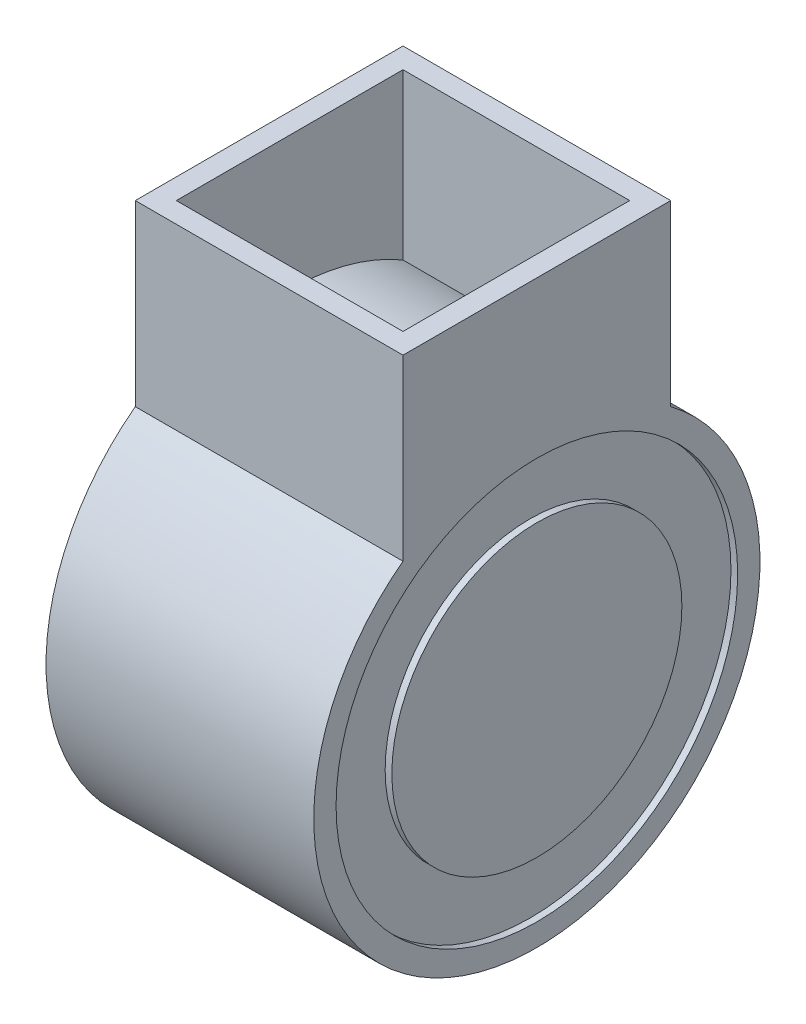
ISO-10303-21;
HEADER;
FILE_DESCRIPTION(('STEP AP214'),'2;1');
FILE_NAME('part.step','',(''),(''),'','','');
FILE_SCHEMA(('AUTOMOTIVE_DESIGN { 1 0 10303 214 1 1 1 1 }'));
ENDSEC;
DATA;
#1=APPLICATION_CONTEXT('core data for automotive mechanical design processes');
#2=APPLICATION_PROTOCOL_DEFINITION('international standard','automotive_design',2000,#1);
#3=PRODUCT_CONTEXT('',#1,'mechanical');
#4=PRODUCT('Part','Part','',(#3));
#5=PRODUCT_RELATED_PRODUCT_CATEGORY('part','',(#4));
#6=PRODUCT_DEFINITION_FORMATION('','',#4);
#7=PRODUCT_DEFINITION_CONTEXT('part definition',#1,'design');
#8=PRODUCT_DEFINITION('design','',#6,#7);
#9=PRODUCT_DEFINITION_SHAPE('','',#8);
#10=(LENGTH_UNIT() NAMED_UNIT(*) SI_UNIT(.MILLI.,.METRE.));
#11=(NAMED_UNIT(*) PLANE_ANGLE_UNIT() SI_UNIT($,.RADIAN.));
#12=(NAMED_UNIT(*) SI_UNIT($,.STERADIAN.) SOLID_ANGLE_UNIT());
#13=UNCERTAINTY_MEASURE_WITH_UNIT(LENGTH_MEASURE(1.E-05),#10,'distance_accuracy_value','');
#14=(GEOMETRIC_REPRESENTATION_CONTEXT(3) GLOBAL_UNCERTAINTY_ASSIGNED_CONTEXT((#13)) GLOBAL_UNIT_ASSIGNED_CONTEXT((#10,
#11,#12)) REPRESENTATION_CONTEXT('',''));
#15=CARTESIAN_POINT('',(0.,0.,0.));
#16=DIRECTION('',(0.,0.,1.));
#17=DIRECTION('',(1.,0.,0.));
#18=AXIS2_PLACEMENT_3D('',#15,#16,#17);
#19=CARTESIAN_POINT('',(30.,0.,0.));
#20=DIRECTION('',(-1.,0.,0.));
#21=DIRECTION('',(0.,0.,1.));
#22=AXIS2_PLACEMENT_3D('',#19,#20,#21);
#23=CYLINDRICAL_SURFACE('',#22,50.);
#24=DIRECTION('',(-1.,0.,0.));
#25=VECTOR('',#24,1.);
#26=CARTESIAN_POINT('',(30.,43.0678534408206,25.4));
#27=LINE('',#26,#25);
#28=CARTESIAN_POINT('',(-25.4,43.0678534408206,25.4));
#29=VERTEX_POINT('',#28);
#30=CARTESIAN_POINT('',(25.4,43.0678534408206,25.4));
#31=VERTEX_POINT('',#30);
#32=EDGE_CURVE('E76',#29,#31,#27,.F.);
#33=ORIENTED_EDGE('',*,*,#32,.T.);
#34=CARTESIAN_POINT('',(25.4,0.,0.));
#35=DIRECTION('',(1.,0.,0.));
#36=DIRECTION('',(0.,0.,-1.));
#37=AXIS2_PLACEMENT_3D('',#34,#35,#36);
#38=CIRCLE('',#37,50.);
#39=CARTESIAN_POINT('',(25.4,43.0678534408206,-25.4));
#40=VERTEX_POINT('',#39);
#41=EDGE_CURVE('E169',#31,#40,#38,.F.);
#42=ORIENTED_EDGE('',*,*,#41,.T.);
#43=DIRECTION('',(-1.,0.,0.));
#44=VECTOR('',#43,1.);
#45=CARTESIAN_POINT('',(30.,43.0678534408206,-25.4));
#46=LINE('',#45,#44);
#47=CARTESIAN_POINT('',(-25.4,43.0678534408206,-25.4));
#48=VERTEX_POINT('',#47);
#49=EDGE_CURVE('E165',#40,#48,#46,.T.);
#50=ORIENTED_EDGE('',*,*,#49,.T.);
#51=CARTESIAN_POINT('',(-25.4,0.,0.));
#52=DIRECTION('',(-1.,0.,0.));
#53=DIRECTION('',(0.,0.,1.));
#54=AXIS2_PLACEMENT_3D('',#51,#52,#53);
#55=CIRCLE('',#54,50.);
#56=EDGE_CURVE('E72',#48,#29,#55,.F.);
#57=ORIENTED_EDGE('',*,*,#56,.T.);
#58=EDGE_LOOP('',(#33,#42,#50,#57));
#59=FACE_BOUND('',#58,.T.);
#60=ADVANCED_FACE('F57',(#59),#23,.T.);
#61=CARTESIAN_POINT('',(-25.4,-50.002,25.4));
#62=DIRECTION('',(0.,0.,1.));
#63=DIRECTION('',(1.,0.,0.));
#64=AXIS2_PLACEMENT_3D('',#61,#62,#63);
#65=PLANE('',#64);
#66=ORIENTED_EDGE('',*,*,#32,.F.);
#67=DIRECTION('',(0.,1.,0.));
#68=VECTOR('',#67,1.);
#69=CARTESIAN_POINT('',(-25.4,-50.002,25.4));
#70=LINE('',#69,#68);
#71=CARTESIAN_POINT('',(-25.4,80.,25.4));
#72=VERTEX_POINT('',#71);
#73=EDGE_CURVE('E155',#29,#72,#70,.T.);
#74=ORIENTED_EDGE('',*,*,#73,.T.);
#75=DIRECTION('',(1.,0.,0.));
#76=VECTOR('',#75,1.);
#77=CARTESIAN_POINT('',(-25.4,80.,25.4));
#78=LINE('',#77,#76);
#79=CARTESIAN_POINT('',(25.4,80.,25.4));
#80=VERTEX_POINT('',#79);
#81=EDGE_CURVE('E252',#72,#80,#78,.T.);
#82=ORIENTED_EDGE('',*,*,#81,.T.);
#83=DIRECTION('',(0.,1.,0.));
#84=VECTOR('',#83,1.);
#85=CARTESIAN_POINT('',(25.4,-50.002,25.4));
#86=LINE('',#85,#84);
#87=EDGE_CURVE('E156',#31,#80,#86,.T.);
#88=ORIENTED_EDGE('',*,*,#87,.F.);
#89=EDGE_LOOP('',(#66,#74,#82,#88));
#90=FACE_BOUND('',#89,.T.);
#91=ADVANCED_FACE('F191',(#90),#65,.F.);
#92=CARTESIAN_POINT('',(-30.,-50.002,-30.));
#93=DIRECTION('',(0.,0.,-1.));
#94=DIRECTION('',(-1.,0.,0.));
#95=AXIS2_PLACEMENT_3D('',#92,#93,#94);
#96=PLANE('',#95);
#97=DIRECTION('',(0.,1.,0.));
#98=VECTOR('',#97,1.);
#99=CARTESIAN_POINT('',(30.,-50.002,-30.));
#100=LINE('',#99,#98);
#101=CARTESIAN_POINT('',(30.,40.,-30.));
#102=VERTEX_POINT('',#101);
#103=CARTESIAN_POINT('',(30.,80.,-30.));
#104=VERTEX_POINT('',#103);
#105=EDGE_CURVE('E130',#102,#104,#100,.T.);
#106=ORIENTED_EDGE('',*,*,#105,.F.);
#107=DIRECTION('',(-1.,0.,0.));
#108=VECTOR('',#107,1.);
#109=CARTESIAN_POINT('',(30.,40.,-30.));
#110=LINE('',#109,#108);
#111=CARTESIAN_POINT('',(-30.,40.,-30.));
#112=VERTEX_POINT('',#111);
#113=EDGE_CURVE('E128',#102,#112,#110,.T.);
#114=ORIENTED_EDGE('',*,*,#113,.T.);
#115=DIRECTION('',(0.,1.,0.));
#116=VECTOR('',#115,1.);
#117=CARTESIAN_POINT('',(-30.,-50.002,-30.));
#118=LINE('',#117,#116);
#119=CARTESIAN_POINT('',(-30.,80.,-30.));
#120=VERTEX_POINT('',#119);
#121=EDGE_CURVE('E121',#112,#120,#118,.T.);
#122=ORIENTED_EDGE('',*,*,#121,.T.);
#123=DIRECTION('',(-1.,0.,0.));
#124=VECTOR('',#123,1.);
#125=CARTESIAN_POINT('',(-30.,80.,-30.));
#126=LINE('',#125,#124);
#127=EDGE_CURVE('E126',#104,#120,#126,.T.);
#128=ORIENTED_EDGE('',*,*,#127,.F.);
#129=EDGE_LOOP('',(#106,#114,#122,#128));
#130=FACE_BOUND('',#129,.T.);
#131=ADVANCED_FACE('F124',(#130),#96,.T.);
#132=CARTESIAN_POINT('',(-25.4,-50.002,25.4));
#133=DIRECTION('',(-1.,0.,0.));
#134=DIRECTION('',(0.,0.,1.));
#135=AXIS2_PLACEMENT_3D('',#132,#133,#134);
#136=PLANE('',#135);
#137=ORIENTED_EDGE('',*,*,#56,.F.);
#138=DIRECTION('',(0.,1.,0.));
#139=VECTOR('',#138,1.);
#140=CARTESIAN_POINT('',(-25.4,-50.002,-25.4));
#141=LINE('',#140,#139);
#142=CARTESIAN_POINT('',(-25.4,80.,-25.4));
#143=VERTEX_POINT('',#142);
#144=EDGE_CURVE('E153',#48,#143,#141,.T.);
#145=ORIENTED_EDGE('',*,*,#144,.T.);
#146=DIRECTION('',(0.,0.,1.));
#147=VECTOR('',#146,1.);
#148=CARTESIAN_POINT('',(-25.4,80.,25.4));
#149=LINE('',#148,#147);
#150=EDGE_CURVE('E255',#143,#72,#149,.T.);
#151=ORIENTED_EDGE('',*,*,#150,.T.);
#152=ORIENTED_EDGE('',*,*,#73,.F.);
#153=EDGE_LOOP('',(#137,#145,#151,#152));
#154=FACE_BOUND('',#153,.T.);
#155=ADVANCED_FACE('F214',(#154),#136,.F.);
#156=CARTESIAN_POINT('',(0.,80.,0.));
#157=DIRECTION('',(0.,-1.,0.));
#158=DIRECTION('',(0.,0.,-1.));
#159=AXIS2_PLACEMENT_3D('',#156,#157,#158);
#160=PLANE('',#159);
#161=DIRECTION('',(0.,0.,-1.));
#162=VECTOR('',#161,1.);
#163=CARTESIAN_POINT('',(30.,80.,30.));
#164=LINE('',#163,#162);
#165=CARTESIAN_POINT('',(30.,80.,30.));
#166=VERTEX_POINT('',#165);
#167=EDGE_CURVE('E145',#166,#104,#164,.T.);
#168=ORIENTED_EDGE('',*,*,#167,.T.);
#169=ORIENTED_EDGE('',*,*,#127,.T.);
#170=DIRECTION('',(0.,0.,1.));
#171=VECTOR('',#170,1.);
#172=CARTESIAN_POINT('',(-30.,80.,30.));
#173=LINE('',#172,#171);
#174=CARTESIAN_POINT('',(-30.,80.,30.));
#175=VERTEX_POINT('',#174);
#176=EDGE_CURVE('E134',#120,#175,#173,.T.);
#177=ORIENTED_EDGE('',*,*,#176,.T.);
#178=DIRECTION('',(1.,0.,0.));
#179=VECTOR('',#178,1.);
#180=CARTESIAN_POINT('',(-30.,80.,30.));
#181=LINE('',#180,#179);
#182=EDGE_CURVE('E140',#175,#166,#181,.T.);
#183=ORIENTED_EDGE('',*,*,#182,.T.);
#184=EDGE_LOOP('',(#168,#169,#177,#183));
#185=FACE_BOUND('',#184,.T.);
#186=DIRECTION('',(0.,0.,-1.));
#187=VECTOR('',#186,1.);
#188=CARTESIAN_POINT('',(25.4,80.,25.4));
#189=LINE('',#188,#187);
#190=CARTESIAN_POINT('',(25.4,80.,-25.4));
#191=VERTEX_POINT('',#190);
#192=EDGE_CURVE('E162',#80,#191,#189,.T.);
#193=ORIENTED_EDGE('',*,*,#192,.F.);
#194=ORIENTED_EDGE('',*,*,#81,.F.);
#195=ORIENTED_EDGE('',*,*,#150,.F.);
#196=DIRECTION('',(-1.,0.,0.));
#197=VECTOR('',#196,1.);
#198=CARTESIAN_POINT('',(-25.4,80.,-25.4));
#199=LINE('',#198,#197);
#200=EDGE_CURVE('E258',#191,#143,#199,.T.);
#201=ORIENTED_EDGE('',*,*,#200,.F.);
#202=EDGE_LOOP('',(#193,#194,#195,#201));
#203=FACE_BOUND('',#202,.T.);
#204=ADVANCED_FACE('F142',(#185,#203),#160,.F.);
#205=CARTESIAN_POINT('',(25.4,-50.002,25.4));
#206=DIRECTION('',(1.,0.,0.));
#207=DIRECTION('',(0.,0.,-1.));
#208=AXIS2_PLACEMENT_3D('',#205,#206,#207);
#209=PLANE('',#208);
#210=ORIENTED_EDGE('',*,*,#41,.F.);
#211=ORIENTED_EDGE('',*,*,#87,.T.);
#212=ORIENTED_EDGE('',*,*,#192,.T.);
#213=DIRECTION('',(0.,1.,0.));
#214=VECTOR('',#213,1.);
#215=CARTESIAN_POINT('',(25.4,-50.002,-25.4));
#216=LINE('',#215,#214);
#217=EDGE_CURVE('E151',#40,#191,#216,.T.);
#218=ORIENTED_EDGE('',*,*,#217,.F.);
#219=EDGE_LOOP('',(#210,#211,#212,#218));
#220=FACE_BOUND('',#219,.T.);
#221=ADVANCED_FACE('F208',(#220),#209,.F.);
#222=CARTESIAN_POINT('',(-25.4,-50.002,-25.4));
#223=DIRECTION('',(0.,0.,-1.));
#224=DIRECTION('',(-1.,0.,0.));
#225=AXIS2_PLACEMENT_3D('',#222,#223,#224);
#226=PLANE('',#225);
#227=ORIENTED_EDGE('',*,*,#49,.F.);
#228=ORIENTED_EDGE('',*,*,#217,.T.);
#229=ORIENTED_EDGE('',*,*,#200,.T.);
#230=ORIENTED_EDGE('',*,*,#144,.F.);
#231=EDGE_LOOP('',(#227,#228,#229,#230));
#232=FACE_BOUND('',#231,.T.);
#233=ADVANCED_FACE('F198',(#232),#226,.F.);
#234=CARTESIAN_POINT('',(-30.,-50.002,30.));
#235=DIRECTION('',(0.,0.,1.));
#236=DIRECTION('',(1.,0.,0.));
#237=AXIS2_PLACEMENT_3D('',#234,#235,#236);
#238=PLANE('',#237);
#239=DIRECTION('',(0.,1.,0.));
#240=VECTOR('',#239,1.);
#241=CARTESIAN_POINT('',(-30.,-50.002,30.));
#242=LINE('',#241,#240);
#243=CARTESIAN_POINT('',(-30.,40.,30.));
#244=VERTEX_POINT('',#243);
#245=EDGE_CURVE('E131',#244,#175,#242,.T.);
#246=ORIENTED_EDGE('',*,*,#245,.F.);
#247=DIRECTION('',(-1.,0.,0.));
#248=VECTOR('',#247,1.);
#249=CARTESIAN_POINT('',(30.,40.,30.));
#250=LINE('',#249,#248);
#251=CARTESIAN_POINT('',(30.,40.,30.));
#252=VERTEX_POINT('',#251);
#253=EDGE_CURVE('E158',#244,#252,#250,.F.);
#254=ORIENTED_EDGE('',*,*,#253,.T.);
#255=DIRECTION('',(0.,1.,0.));
#256=VECTOR('',#255,1.);
#257=CARTESIAN_POINT('',(30.,-50.002,30.));
#258=LINE('',#257,#256);
#259=EDGE_CURVE('E160',#252,#166,#258,.T.);
#260=ORIENTED_EDGE('',*,*,#259,.T.);
#261=ORIENTED_EDGE('',*,*,#182,.F.);
#262=EDGE_LOOP('',(#246,#254,#260,#261));
#263=FACE_BOUND('',#262,.T.);
#264=ADVANCED_FACE('F176',(#263),#238,.T.);
#265=CARTESIAN_POINT('',(30.,0.,0.));
#266=DIRECTION('',(1.,0.,0.));
#267=DIRECTION('',(0.,0.,-1.));
#268=AXIS2_PLACEMENT_3D('',#265,#266,#267);
#269=PLANE('',#268);
#270=CARTESIAN_POINT('',(30.,0.,0.));
#271=DIRECTION('',(1.,0.,0.));
#272=DIRECTION('',(0.,0.,-1.));
#273=AXIS2_PLACEMENT_3D('',#270,#271,#272);
#274=CIRCLE('',#273,45.);
#275=CARTESIAN_POINT('',(30.,0.,-45.));
#276=VERTEX_POINT('',#275);
#277=EDGE_CURVE('E245',#276,#276,#274,.T.);
#278=ORIENTED_EDGE('',*,*,#277,.F.);
#279=EDGE_LOOP('',(#278));
#280=FACE_BOUND('',#279,.T.);
#281=CARTESIAN_POINT('',(30.,0.,0.));
#282=DIRECTION('',(1.,0.,0.));
#283=DIRECTION('',(0.,0.,-1.));
#284=AXIS2_PLACEMENT_3D('',#281,#282,#283);
#285=CIRCLE('',#284,50.);
#286=EDGE_CURVE('E12',#252,#102,#285,.T.);
#287=ORIENTED_EDGE('',*,*,#286,.T.);
#288=ORIENTED_EDGE('',*,*,#105,.T.);
#289=ORIENTED_EDGE('',*,*,#167,.F.);
#290=ORIENTED_EDGE('',*,*,#259,.F.);
#291=EDGE_LOOP('',(#287,#288,#289,#290));
#292=FACE_BOUND('',#291,.T.);
#293=ADVANCED_FACE('F179',(#280,#292),#269,.T.);
#294=CARTESIAN_POINT('',(-30.,0.,0.));
#295=DIRECTION('',(1.,0.,0.));
#296=DIRECTION('',(0.,0.,-1.));
#297=AXIS2_PLACEMENT_3D('',#294,#295,#296);
#298=PLANE('',#297);
#299=CARTESIAN_POINT('',(-30.,0.,0.));
#300=DIRECTION('',(1.,0.,0.));
#301=DIRECTION('',(0.,0.,-1.));
#302=AXIS2_PLACEMENT_3D('',#299,#300,#301);
#303=CIRCLE('',#302,50.);
#304=EDGE_CURVE('E61',#244,#112,#303,.T.);
#305=ORIENTED_EDGE('',*,*,#304,.F.);
#306=ORIENTED_EDGE('',*,*,#245,.T.);
#307=ORIENTED_EDGE('',*,*,#176,.F.);
#308=ORIENTED_EDGE('',*,*,#121,.F.);
#309=EDGE_LOOP('',(#305,#306,#307,#308));
#310=FACE_BOUND('',#309,.T.);
#311=ADVANCED_FACE('F135',(#310),#298,.F.);
#312=ORIENTED_EDGE('',*,*,#304,.T.);
#313=ORIENTED_EDGE('',*,*,#113,.F.);
#314=ORIENTED_EDGE('',*,*,#286,.F.);
#315=ORIENTED_EDGE('',*,*,#253,.F.);
#316=EDGE_LOOP('',(#312,#313,#314,#315));
#317=FACE_BOUND('',#316,.T.);
#318=ADVANCED_FACE('F59',(#317),#23,.T.);
#319=CARTESIAN_POINT('',(28.5,0.,0.));
#320=DIRECTION('',(1.,0.,0.));
#321=DIRECTION('',(0.,0.,-1.));
#322=AXIS2_PLACEMENT_3D('',#319,#320,#321);
#323=CYLINDRICAL_SURFACE('',#322,45.);
#324=CARTESIAN_POINT('',(28.5,0.,0.));
#325=DIRECTION('',(1.,0.,0.));
#326=DIRECTION('',(0.,0.,-1.));
#327=AXIS2_PLACEMENT_3D('',#324,#325,#326);
#328=CIRCLE('',#327,45.);
#329=CARTESIAN_POINT('',(28.5,0.,-45.));
#330=VERTEX_POINT('',#329);
#331=EDGE_CURVE('E147',#330,#330,#328,.T.);
#332=ORIENTED_EDGE('',*,*,#331,.F.);
#333=EDGE_LOOP('',(#332));
#334=FACE_BOUND('',#333,.T.);
#335=ORIENTED_EDGE('',*,*,#277,.T.);
#336=EDGE_LOOP('',(#335));
#337=FACE_BOUND('',#336,.T.);
#338=ADVANCED_FACE('F181',(#334,#337),#323,.F.);
#339=CARTESIAN_POINT('',(28.5,0.,0.));
#340=DIRECTION('',(1.,0.,0.));
#341=DIRECTION('',(0.,0.,-1.));
#342=AXIS2_PLACEMENT_3D('',#339,#340,#341);
#343=PLANE('',#342);
#344=CARTESIAN_POINT('',(28.5,0.,0.));
#345=DIRECTION('',(1.,0.,0.));
#346=DIRECTION('',(0.,0.,-1.));
#347=AXIS2_PLACEMENT_3D('',#344,#345,#346);
#348=CIRCLE('',#347,32.5);
#349=CARTESIAN_POINT('',(28.5,0.,-32.5));
#350=VERTEX_POINT('',#349);
#351=EDGE_CURVE('E240',#350,#350,#348,.T.);
#352=ORIENTED_EDGE('',*,*,#351,.F.);
#353=EDGE_LOOP('',(#352));
#354=FACE_BOUND('',#353,.T.);
#355=ORIENTED_EDGE('',*,*,#331,.T.);
#356=EDGE_LOOP('',(#355));
#357=FACE_BOUND('',#356,.T.);
#358=ADVANCED_FACE('F187',(#354,#357),#343,.T.);
#359=CARTESIAN_POINT('',(28.5,0.,0.));
#360=DIRECTION('',(1.,0.,0.));
#361=DIRECTION('',(0.,0.,-1.));
#362=AXIS2_PLACEMENT_3D('',#359,#360,#361);
#363=CYLINDRICAL_SURFACE('',#362,32.5);
#364=ORIENTED_EDGE('',*,*,#351,.T.);
#365=EDGE_LOOP('',(#364));
#366=FACE_BOUND('',#365,.T.);
#367=CARTESIAN_POINT('',(30.,0.,0.));
#368=DIRECTION('',(1.,0.,0.));
#369=DIRECTION('',(0.,0.,-1.));
#370=AXIS2_PLACEMENT_3D('',#367,#368,#369);
#371=CIRCLE('',#370,32.5);
#372=CARTESIAN_POINT('',(30.,0.,-32.5));
#373=VERTEX_POINT('',#372);
#374=EDGE_CURVE('E243',#373,#373,#371,.T.);
#375=ORIENTED_EDGE('',*,*,#374,.F.);
#376=EDGE_LOOP('',(#375));
#377=FACE_BOUND('',#376,.T.);
#378=ADVANCED_FACE('F229',(#366,#377),#363,.T.);
#379=ORIENTED_EDGE('',*,*,#374,.T.);
#380=EDGE_LOOP('',(#379));
#381=FACE_BOUND('',#380,.T.);
#382=ADVANCED_FACE('F207',(#381),#269,.T.);
#383=CLOSED_SHELL('',(#60,#91,#131,#155,#204,#221,#233,#264,#293,#311,#318,#338,#358,#378,#382));
#384=MANIFOLD_SOLID_BREP('B2',#383);
#385=ADVANCED_BREP_SHAPE_REPRESENTATION('',(#18,#384),#14);
#386=SHAPE_DEFINITION_REPRESENTATION(#9,#385);
ENDSEC;
END-ISO-10303-21;
